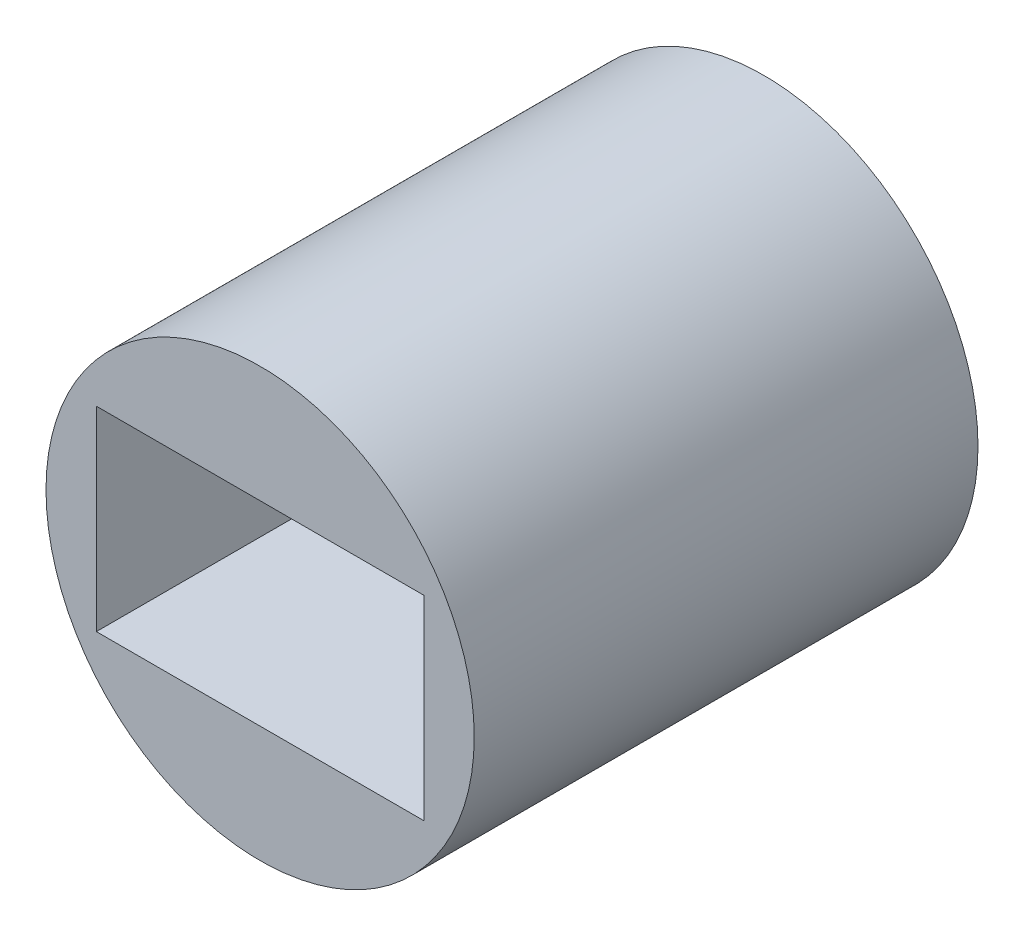
ISO-10303-21;
HEADER;
FILE_DESCRIPTION(('STEP AP214'),'2;1');
FILE_NAME('part.step','',(''),(''),'','','');
FILE_SCHEMA(('AUTOMOTIVE_DESIGN { 1 0 10303 214 1 1 1 1 }'));
ENDSEC;
DATA;
#1=APPLICATION_CONTEXT('core data for automotive mechanical design processes');
#2=APPLICATION_PROTOCOL_DEFINITION('international standard','automotive_design',2000,#1);
#3=PRODUCT_CONTEXT('',#1,'mechanical');
#4=PRODUCT('Part','Part','',(#3));
#5=PRODUCT_RELATED_PRODUCT_CATEGORY('part','',(#4));
#6=PRODUCT_DEFINITION_FORMATION('','',#4);
#7=PRODUCT_DEFINITION_CONTEXT('part definition',#1,'design');
#8=PRODUCT_DEFINITION('design','',#6,#7);
#9=PRODUCT_DEFINITION_SHAPE('','',#8);
#10=(LENGTH_UNIT() NAMED_UNIT(*) SI_UNIT(.MILLI.,.METRE.));
#11=(NAMED_UNIT(*) PLANE_ANGLE_UNIT() SI_UNIT($,.RADIAN.));
#12=(NAMED_UNIT(*) SI_UNIT($,.STERADIAN.) SOLID_ANGLE_UNIT());
#13=UNCERTAINTY_MEASURE_WITH_UNIT(LENGTH_MEASURE(1.E-05),#10,'distance_accuracy_value','');
#14=(GEOMETRIC_REPRESENTATION_CONTEXT(3) GLOBAL_UNCERTAINTY_ASSIGNED_CONTEXT((#13)) GLOBAL_UNIT_ASSIGNED_CONTEXT((#10,
#11,#12)) REPRESENTATION_CONTEXT('',''));
#15=CARTESIAN_POINT('',(0.,0.,0.));
#16=DIRECTION('',(0.,0.,1.));
#17=DIRECTION('',(1.,0.,0.));
#18=AXIS2_PLACEMENT_3D('',#15,#16,#17);
#19=CARTESIAN_POINT('',(0.,0.,8.));
#20=DIRECTION('',(0.,0.,1.));
#21=DIRECTION('',(1.,0.,0.));
#22=AXIS2_PLACEMENT_3D('',#19,#20,#21);
#23=PLANE('',#22);
#24=CARTESIAN_POINT('',(0.,0.,8.));
#25=DIRECTION('',(0.,0.,1.));
#26=DIRECTION('',(1.,0.,0.));
#27=AXIS2_PLACEMENT_3D('',#24,#25,#26);
#28=CIRCLE('',#27,3.4);
#29=CARTESIAN_POINT('',(3.4,0.,8.));
#30=VERTEX_POINT('',#29);
#31=EDGE_CURVE('E11',#30,#30,#28,.T.);
#32=ORIENTED_EDGE('',*,*,#31,.T.);
#33=EDGE_LOOP('',(#32));
#34=FACE_BOUND('',#33,.T.);
#35=DIRECTION('',(-1.,0.,0.));
#36=VECTOR('',#35,1.);
#37=CARTESIAN_POINT('',(-2.6,1.55,8.));
#38=LINE('',#37,#36);
#39=CARTESIAN_POINT('',(2.6,1.55,8.));
#40=VERTEX_POINT('',#39);
#41=CARTESIAN_POINT('',(-2.6,1.55,8.));
#42=VERTEX_POINT('',#41);
#43=EDGE_CURVE('E90',#40,#42,#38,.T.);
#44=ORIENTED_EDGE('',*,*,#43,.F.);
#45=DIRECTION('',(0.,1.,0.));
#46=VECTOR('',#45,1.);
#47=CARTESIAN_POINT('',(2.6,1.55,8.));
#48=LINE('',#47,#46);
#49=CARTESIAN_POINT('',(2.6,-1.55,8.));
#50=VERTEX_POINT('',#49);
#51=EDGE_CURVE('E81',#50,#40,#48,.T.);
#52=ORIENTED_EDGE('',*,*,#51,.F.);
#53=DIRECTION('',(1.,0.,0.));
#54=VECTOR('',#53,1.);
#55=CARTESIAN_POINT('',(-2.6,-1.55,8.));
#56=LINE('',#55,#54);
#57=CARTESIAN_POINT('',(-2.6,-1.55,8.));
#58=VERTEX_POINT('',#57);
#59=EDGE_CURVE('E106',#58,#50,#56,.T.);
#60=ORIENTED_EDGE('',*,*,#59,.F.);
#61=DIRECTION('',(0.,-1.,0.));
#62=VECTOR('',#61,1.);
#63=CARTESIAN_POINT('',(-2.6,1.55,8.));
#64=LINE('',#63,#62);
#65=EDGE_CURVE('E102',#42,#58,#64,.T.);
#66=ORIENTED_EDGE('',*,*,#65,.F.);
#67=EDGE_LOOP('',(#44,#52,#60,#66));
#68=FACE_BOUND('',#67,.T.);
#69=ADVANCED_FACE('F39',(#34,#68),#23,.T.);
#70=CARTESIAN_POINT('',(0.,0.,0.));
#71=DIRECTION('',(0.,0.,1.));
#72=DIRECTION('',(1.,0.,0.));
#73=AXIS2_PLACEMENT_3D('',#70,#71,#72);
#74=PLANE('',#73);
#75=CARTESIAN_POINT('',(0.,0.,0.));
#76=DIRECTION('',(0.,0.,1.));
#77=DIRECTION('',(1.,0.,0.));
#78=AXIS2_PLACEMENT_3D('',#75,#76,#77);
#79=CIRCLE('',#78,3.4);
#80=CARTESIAN_POINT('',(3.4,0.,0.));
#81=VERTEX_POINT('',#80);
#82=EDGE_CURVE('E43',#81,#81,#79,.T.);
#83=ORIENTED_EDGE('',*,*,#82,.F.);
#84=EDGE_LOOP('',(#83));
#85=FACE_BOUND('',#84,.T.);
#86=DIRECTION('',(0.,1.,0.));
#87=VECTOR('',#86,1.);
#88=CARTESIAN_POINT('',(2.6,1.55,0.));
#89=LINE('',#88,#87);
#90=CARTESIAN_POINT('',(2.6,-1.55,0.));
#91=VERTEX_POINT('',#90);
#92=CARTESIAN_POINT('',(2.6,1.55,0.));
#93=VERTEX_POINT('',#92);
#94=EDGE_CURVE('E63',#91,#93,#89,.T.);
#95=ORIENTED_EDGE('',*,*,#94,.T.);
#96=DIRECTION('',(-1.,0.,0.));
#97=VECTOR('',#96,1.);
#98=CARTESIAN_POINT('',(-2.6,1.55,0.));
#99=LINE('',#98,#97);
#100=CARTESIAN_POINT('',(-2.6,1.55,0.));
#101=VERTEX_POINT('',#100);
#102=EDGE_CURVE('E97',#93,#101,#99,.T.);
#103=ORIENTED_EDGE('',*,*,#102,.T.);
#104=DIRECTION('',(0.,-1.,0.));
#105=VECTOR('',#104,1.);
#106=CARTESIAN_POINT('',(-2.6,1.55,0.));
#107=LINE('',#106,#105);
#108=CARTESIAN_POINT('',(-2.6,-1.55,0.));
#109=VERTEX_POINT('',#108);
#110=EDGE_CURVE('E115',#101,#109,#107,.T.);
#111=ORIENTED_EDGE('',*,*,#110,.T.);
#112=DIRECTION('',(1.,0.,0.));
#113=VECTOR('',#112,1.);
#114=CARTESIAN_POINT('',(-2.6,-1.55,0.));
#115=LINE('',#114,#113);
#116=EDGE_CURVE('E91',#109,#91,#115,.T.);
#117=ORIENTED_EDGE('',*,*,#116,.T.);
#118=EDGE_LOOP('',(#95,#103,#111,#117));
#119=FACE_BOUND('',#118,.T.);
#120=ADVANCED_FACE('F131',(#85,#119),#74,.F.);
#121=CARTESIAN_POINT('',(0.,0.,8.));
#122=DIRECTION('',(0.,0.,-1.));
#123=DIRECTION('',(-1.,0.,0.));
#124=AXIS2_PLACEMENT_3D('',#121,#122,#123);
#125=CYLINDRICAL_SURFACE('',#124,3.4);
#126=ORIENTED_EDGE('',*,*,#31,.F.);
#127=EDGE_LOOP('',(#126));
#128=FACE_BOUND('',#127,.T.);
#129=ORIENTED_EDGE('',*,*,#82,.T.);
#130=EDGE_LOOP('',(#129));
#131=FACE_BOUND('',#130,.T.);
#132=ADVANCED_FACE('F41',(#128,#131),#125,.T.);
#133=CARTESIAN_POINT('',(2.6,1.55,8.));
#134=DIRECTION('',(-1.,0.,0.));
#135=DIRECTION('',(0.,-1.,0.));
#136=AXIS2_PLACEMENT_3D('',#133,#134,#135);
#137=PLANE('',#136);
#138=ORIENTED_EDGE('',*,*,#94,.F.);
#139=DIRECTION('',(0.,0.,-1.));
#140=VECTOR('',#139,1.);
#141=CARTESIAN_POINT('',(2.6,-1.55,8.));
#142=LINE('',#141,#140);
#143=EDGE_CURVE('E85',#50,#91,#142,.T.);
#144=ORIENTED_EDGE('',*,*,#143,.F.);
#145=ORIENTED_EDGE('',*,*,#51,.T.);
#146=DIRECTION('',(0.,0.,-1.));
#147=VECTOR('',#146,1.);
#148=CARTESIAN_POINT('',(2.6,1.55,8.));
#149=LINE('',#148,#147);
#150=EDGE_CURVE('E84',#40,#93,#149,.T.);
#151=ORIENTED_EDGE('',*,*,#150,.T.);
#152=EDGE_LOOP('',(#138,#144,#145,#151));
#153=FACE_BOUND('',#152,.T.);
#154=ADVANCED_FACE('F83',(#153),#137,.T.);
#155=CARTESIAN_POINT('',(-2.6,1.55,8.));
#156=DIRECTION('',(0.,-1.,0.));
#157=DIRECTION('',(0.,0.,-1.));
#158=AXIS2_PLACEMENT_3D('',#155,#156,#157);
#159=PLANE('',#158);
#160=ORIENTED_EDGE('',*,*,#102,.F.);
#161=ORIENTED_EDGE('',*,*,#150,.F.);
#162=ORIENTED_EDGE('',*,*,#43,.T.);
#163=DIRECTION('',(0.,0.,-1.));
#164=VECTOR('',#163,1.);
#165=CARTESIAN_POINT('',(-2.6,1.55,8.));
#166=LINE('',#165,#164);
#167=EDGE_CURVE('E99',#42,#101,#166,.T.);
#168=ORIENTED_EDGE('',*,*,#167,.T.);
#169=EDGE_LOOP('',(#160,#161,#162,#168));
#170=FACE_BOUND('',#169,.T.);
#171=ADVANCED_FACE('F94',(#170),#159,.T.);
#172=CARTESIAN_POINT('',(-2.6,1.55,8.));
#173=DIRECTION('',(1.,0.,0.));
#174=DIRECTION('',(0.,1.,0.));
#175=AXIS2_PLACEMENT_3D('',#172,#173,#174);
#176=PLANE('',#175);
#177=ORIENTED_EDGE('',*,*,#110,.F.);
#178=ORIENTED_EDGE('',*,*,#167,.F.);
#179=ORIENTED_EDGE('',*,*,#65,.T.);
#180=DIRECTION('',(0.,0.,-1.));
#181=VECTOR('',#180,1.);
#182=CARTESIAN_POINT('',(-2.6,-1.55,8.));
#183=LINE('',#182,#181);
#184=EDGE_CURVE('E55',#58,#109,#183,.T.);
#185=ORIENTED_EDGE('',*,*,#184,.T.);
#186=EDGE_LOOP('',(#177,#178,#179,#185));
#187=FACE_BOUND('',#186,.T.);
#188=ADVANCED_FACE('F129',(#187),#176,.T.);
#189=CARTESIAN_POINT('',(-2.6,-1.55,8.));
#190=DIRECTION('',(0.,1.,0.));
#191=DIRECTION('',(0.,0.,1.));
#192=AXIS2_PLACEMENT_3D('',#189,#190,#191);
#193=PLANE('',#192);
#194=ORIENTED_EDGE('',*,*,#116,.F.);
#195=ORIENTED_EDGE('',*,*,#184,.F.);
#196=ORIENTED_EDGE('',*,*,#59,.T.);
#197=ORIENTED_EDGE('',*,*,#143,.T.);
#198=EDGE_LOOP('',(#194,#195,#196,#197));
#199=FACE_BOUND('',#198,.T.);
#200=ADVANCED_FACE('F132',(#199),#193,.T.);
#201=CLOSED_SHELL('',(#69,#120,#132,#154,#171,#188,#200));
#202=MANIFOLD_SOLID_BREP('B2',#201);
#203=ADVANCED_BREP_SHAPE_REPRESENTATION('',(#18,#202),#14);
#204=SHAPE_DEFINITION_REPRESENTATION(#9,#203);
ENDSEC;
END-ISO-10303-21;
